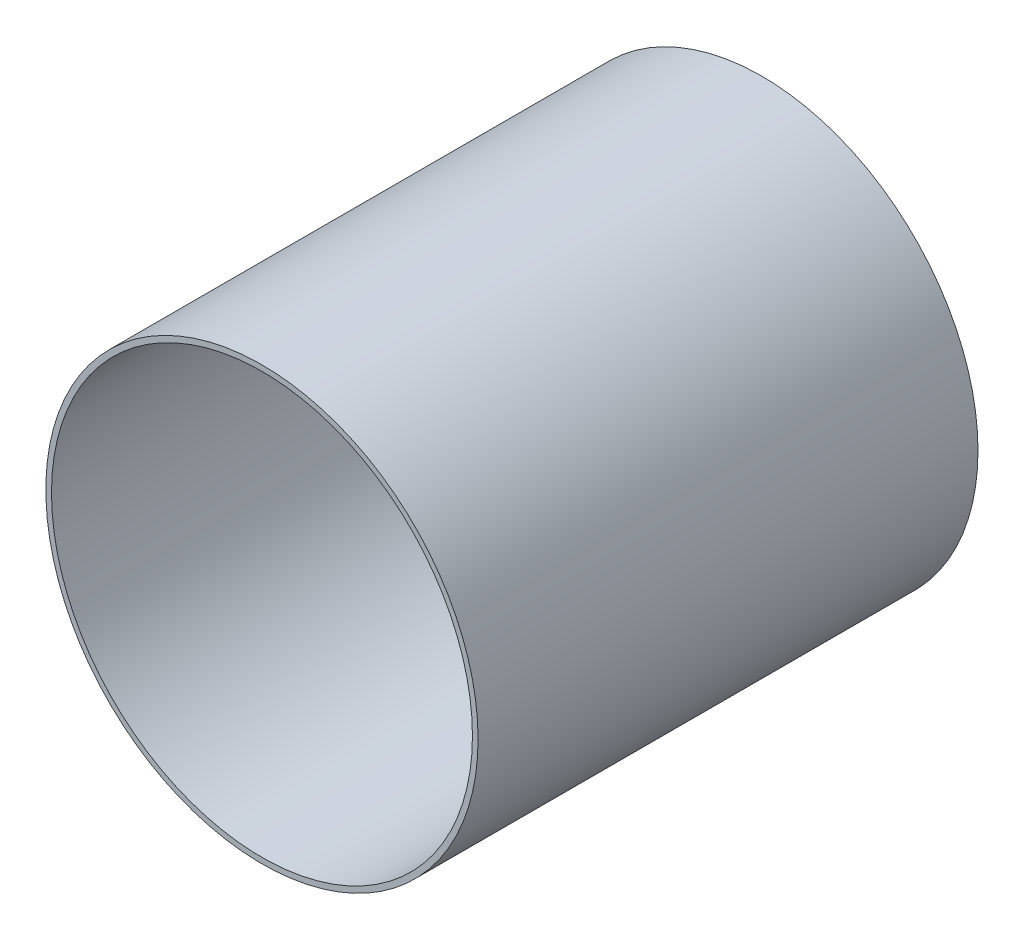
ISO-10303-21;
HEADER;
FILE_DESCRIPTION(('STEP AP214'),'2;1');
FILE_NAME('part.step','',(''),(''),'','','');
FILE_SCHEMA(('AUTOMOTIVE_DESIGN { 1 0 10303 214 1 1 1 1 }'));
ENDSEC;
DATA;
#1=APPLICATION_CONTEXT('core data for automotive mechanical design processes');
#2=APPLICATION_PROTOCOL_DEFINITION('international standard','automotive_design',2000,#1);
#3=PRODUCT_CONTEXT('',#1,'mechanical');
#4=PRODUCT('Part','Part','',(#3));
#5=PRODUCT_RELATED_PRODUCT_CATEGORY('part','',(#4));
#6=PRODUCT_DEFINITION_FORMATION('','',#4);
#7=PRODUCT_DEFINITION_CONTEXT('part definition',#1,'design');
#8=PRODUCT_DEFINITION('design','',#6,#7);
#9=PRODUCT_DEFINITION_SHAPE('','',#8);
#10=(LENGTH_UNIT() NAMED_UNIT(*) SI_UNIT(.MILLI.,.METRE.));
#11=(NAMED_UNIT(*) PLANE_ANGLE_UNIT() SI_UNIT($,.RADIAN.));
#12=(NAMED_UNIT(*) SI_UNIT($,.STERADIAN.) SOLID_ANGLE_UNIT());
#13=UNCERTAINTY_MEASURE_WITH_UNIT(LENGTH_MEASURE(1.E-05),#10,'distance_accuracy_value','');
#14=(GEOMETRIC_REPRESENTATION_CONTEXT(3) GLOBAL_UNCERTAINTY_ASSIGNED_CONTEXT((#13)) GLOBAL_UNIT_ASSIGNED_CONTEXT((#10,
#11,#12)) REPRESENTATION_CONTEXT('',''));
#15=CARTESIAN_POINT('',(0.,0.,0.));
#16=DIRECTION('',(0.,0.,1.));
#17=DIRECTION('',(1.,0.,0.));
#18=AXIS2_PLACEMENT_3D('',#15,#16,#17);
#19=CARTESIAN_POINT('',(0.,0.,177.3));
#20=DIRECTION('',(0.,0.,1.));
#21=DIRECTION('',(1.,0.,0.));
#22=AXIS2_PLACEMENT_3D('',#19,#20,#21);
#23=PLANE('',#22);
#24=CARTESIAN_POINT('',(0.,0.,177.3));
#25=DIRECTION('',(0.,0.,1.));
#26=DIRECTION('',(1.,0.,0.));
#27=AXIS2_PLACEMENT_3D('',#24,#25,#26);
#28=CIRCLE('',#27,76.65);
#29=CARTESIAN_POINT('',(76.65,0.,177.3));
#30=VERTEX_POINT('',#29);
#31=EDGE_CURVE('E10',#30,#30,#28,.T.);
#32=ORIENTED_EDGE('',*,*,#31,.T.);
#33=EDGE_LOOP('',(#32));
#34=FACE_BOUND('',#33,.T.);
#35=CARTESIAN_POINT('',(0.,0.,177.3));
#36=DIRECTION('',(0.,0.,1.));
#37=DIRECTION('',(1.,0.,0.));
#38=AXIS2_PLACEMENT_3D('',#35,#36,#37);
#39=CIRCLE('',#38,74.65);
#40=CARTESIAN_POINT('',(74.65,0.,177.3));
#41=VERTEX_POINT('',#40);
#42=EDGE_CURVE('E44',#41,#41,#39,.T.);
#43=ORIENTED_EDGE('',*,*,#42,.F.);
#44=EDGE_LOOP('',(#43));
#45=FACE_BOUND('',#44,.T.);
#46=ADVANCED_FACE('F33',(#34,#45),#23,.T.);
#47=CARTESIAN_POINT('',(0.,0.,0.));
#48=DIRECTION('',(0.,0.,1.));
#49=DIRECTION('',(1.,0.,0.));
#50=AXIS2_PLACEMENT_3D('',#47,#48,#49);
#51=PLANE('',#50);
#52=CARTESIAN_POINT('',(0.,0.,0.));
#53=DIRECTION('',(0.,0.,1.));
#54=DIRECTION('',(1.,0.,0.));
#55=AXIS2_PLACEMENT_3D('',#52,#53,#54);
#56=CIRCLE('',#55,76.65);
#57=CARTESIAN_POINT('',(76.65,0.,0.));
#58=VERTEX_POINT('',#57);
#59=EDGE_CURVE('E37',#58,#58,#56,.T.);
#60=ORIENTED_EDGE('',*,*,#59,.F.);
#61=EDGE_LOOP('',(#60));
#62=FACE_BOUND('',#61,.T.);
#63=CARTESIAN_POINT('',(0.,0.,0.));
#64=DIRECTION('',(0.,0.,1.));
#65=DIRECTION('',(1.,0.,0.));
#66=AXIS2_PLACEMENT_3D('',#63,#64,#65);
#67=CIRCLE('',#66,74.65);
#68=CARTESIAN_POINT('',(74.65,0.,0.));
#69=VERTEX_POINT('',#68);
#70=EDGE_CURVE('E46',#69,#69,#67,.T.);
#71=ORIENTED_EDGE('',*,*,#70,.T.);
#72=EDGE_LOOP('',(#71));
#73=FACE_BOUND('',#72,.T.);
#74=ADVANCED_FACE('F56',(#62,#73),#51,.F.);
#75=CARTESIAN_POINT('',(0.,0.,177.3));
#76=DIRECTION('',(0.,0.,-1.));
#77=DIRECTION('',(-1.,0.,0.));
#78=AXIS2_PLACEMENT_3D('',#75,#76,#77);
#79=CYLINDRICAL_SURFACE('',#78,76.65);
#80=ORIENTED_EDGE('',*,*,#31,.F.);
#81=EDGE_LOOP('',(#80));
#82=FACE_BOUND('',#81,.T.);
#83=ORIENTED_EDGE('',*,*,#59,.T.);
#84=EDGE_LOOP('',(#83));
#85=FACE_BOUND('',#84,.T.);
#86=ADVANCED_FACE('F35',(#82,#85),#79,.T.);
#87=CARTESIAN_POINT('',(0.,0.,177.3));
#88=DIRECTION('',(0.,0.,-1.));
#89=DIRECTION('',(-1.,0.,0.));
#90=AXIS2_PLACEMENT_3D('',#87,#88,#89);
#91=CYLINDRICAL_SURFACE('',#90,74.65);
#92=ORIENTED_EDGE('',*,*,#42,.T.);
#93=EDGE_LOOP('',(#92));
#94=FACE_BOUND('',#93,.T.);
#95=ORIENTED_EDGE('',*,*,#70,.F.);
#96=EDGE_LOOP('',(#95));
#97=FACE_BOUND('',#96,.T.);
#98=ADVANCED_FACE('F52',(#94,#97),#91,.F.);
#99=CLOSED_SHELL('',(#46,#74,#86,#98));
#100=MANIFOLD_SOLID_BREP('B2',#99);
#101=ADVANCED_BREP_SHAPE_REPRESENTATION('',(#18,#100),#14);
#102=SHAPE_DEFINITION_REPRESENTATION(#9,#101);
ENDSEC;
END-ISO-10303-21;
